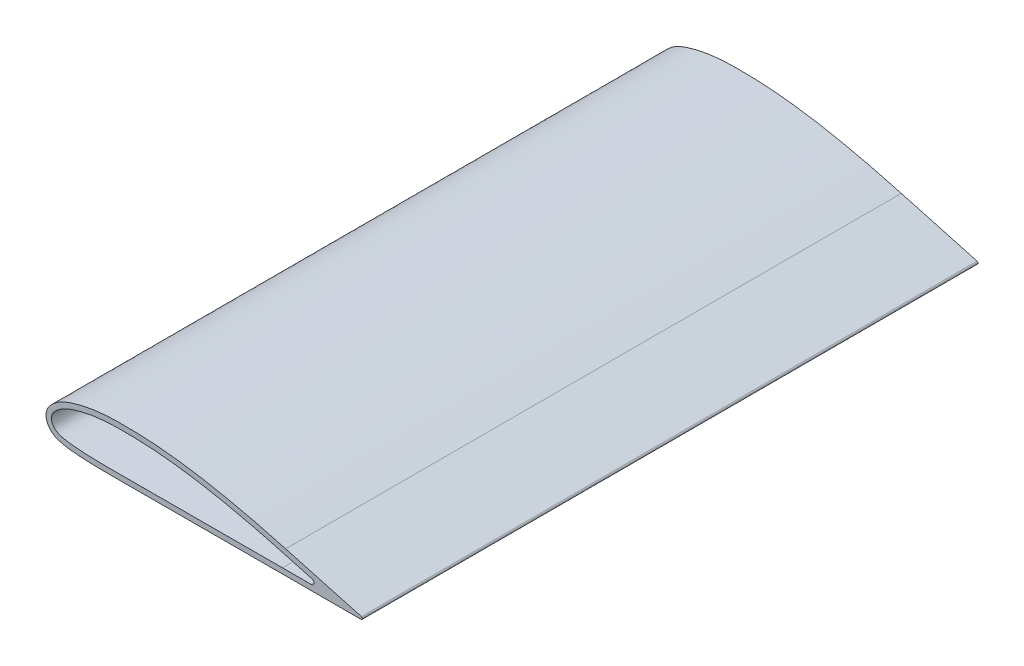
ISO-10303-21;
HEADER;
FILE_DESCRIPTION(('STEP AP214'),'2;1');
FILE_NAME('part.step','',(''),(''),'','','');
FILE_SCHEMA(('AUTOMOTIVE_DESIGN { 1 0 10303 214 1 1 1 1 }'));
ENDSEC;
DATA;
#1=APPLICATION_CONTEXT('core data for automotive mechanical design processes');
#2=APPLICATION_PROTOCOL_DEFINITION('international standard','automotive_design',2000,#1);
#3=PRODUCT_CONTEXT('',#1,'mechanical');
#4=PRODUCT('Part','Part','',(#3));
#5=PRODUCT_RELATED_PRODUCT_CATEGORY('part','',(#4));
#6=PRODUCT_DEFINITION_FORMATION('','',#4);
#7=PRODUCT_DEFINITION_CONTEXT('part definition',#1,'design');
#8=PRODUCT_DEFINITION('design','',#6,#7);
#9=PRODUCT_DEFINITION_SHAPE('','',#8);
#10=(LENGTH_UNIT() NAMED_UNIT(*) SI_UNIT(.MILLI.,.METRE.));
#11=(NAMED_UNIT(*) PLANE_ANGLE_UNIT() SI_UNIT($,.RADIAN.));
#12=(NAMED_UNIT(*) SI_UNIT($,.STERADIAN.) SOLID_ANGLE_UNIT());
#13=UNCERTAINTY_MEASURE_WITH_UNIT(LENGTH_MEASURE(1.E-05),#10,'distance_accuracy_value','');
#14=(GEOMETRIC_REPRESENTATION_CONTEXT(3) GLOBAL_UNCERTAINTY_ASSIGNED_CONTEXT((#13)) GLOBAL_UNIT_ASSIGNED_CONTEXT((#10,
#11,#12)) REPRESENTATION_CONTEXT('',''));
#15=CARTESIAN_POINT('',(0.,0.,0.));
#16=DIRECTION('',(0.,0.,1.));
#17=DIRECTION('',(1.,0.,0.));
#18=AXIS2_PLACEMENT_3D('',#15,#16,#17);
#19=CARTESIAN_POINT('',(442.557049847993,28.8562779930486,1000.));
#20=CARTESIAN_POINT('',(439.072672672651,29.8120661893965,1000.));
#21=CARTESIAN_POINT('',(432.099912620264,31.6715962162049,1000.));
#22=CARTESIAN_POINT('',(421.486806005528,34.1105780280946,1000.));
#23=CARTESIAN_POINT('',(410.779849110611,36.1975398101461,1000.));
#24=CARTESIAN_POINT('',(401.720197274352,37.488657383955,1000.));
#25=CARTESIAN_POINT('',(394.41281853896,38.2045326701608,1000.));
#26=CARTESIAN_POINT('',(388.865337545691,38.5359098487311,1000.));
#27=CARTESIAN_POINT('',(383.377043684156,38.6453962158012,1000.));
#28=CARTESIAN_POINT('',(378.776739099679,38.6310045666827,1000.));
#29=CARTESIAN_POINT('',(374.963490259182,38.4319190984465,1000.));
#30=CARTESIAN_POINT('',(372.066182641251,38.140016341929,1000.));
#31=CARTESIAN_POINT('',(369.210683302152,37.7069672209041,1000.));
#32=CARTESIAN_POINT('',(366.827818433234,37.2314362615503,1000.));
#33=CARTESIAN_POINT('',(364.908429325882,36.7538958923076,1000.));
#34=CARTESIAN_POINT('',(363.479940401,36.3494856552582,1000.));
#35=CARTESIAN_POINT('',(362.056434922454,35.8957673309557,1000.));
#36=CARTESIAN_POINT('',(360.572839348893,35.35285722665,1000.));
#37=CARTESIAN_POINT('',(359.28769826388,34.7841452711708,1000.));
#38=CARTESIAN_POINT('',(358.216447641223,34.2146001399463,1000.));
#39=CARTESIAN_POINT('',(357.389050585476,33.7068980737799,1000.));
#40=CARTESIAN_POINT('',(356.552615658043,33.1030648747338,1000.));
#41=CARTESIAN_POINT('',(355.820762745851,32.4753357525396,1000.));
#42=CARTESIAN_POINT('',(355.354503462645,32.0442095034921,1000.));
#43=CARTESIAN_POINT('',(354.855699670665,31.5528495532229,1000.));
#44=CARTESIAN_POINT('',(354.389957132187,31.0255851572889,1000.));
#45=CARTESIAN_POINT('',(353.964999314076,30.4492034467225,1000.));
#46=CARTESIAN_POINT('',(353.586282932792,29.767186255399,1000.));
#47=CARTESIAN_POINT('',(353.227738954648,28.9329442974887,1000.));
#48=CARTESIAN_POINT('',(352.961298812208,27.6499416267636,1000.));
#49=CARTESIAN_POINT('',(353.111643283169,26.2983268889727,1000.));
#50=CARTESIAN_POINT('',(353.365330175192,25.4506232836227,1000.));
#51=CARTESIAN_POINT('',(353.695602528084,24.7528864611856,1000.));
#52=CARTESIAN_POINT('',(353.998210399166,24.262418144221,1000.));
#53=CARTESIAN_POINT('',(354.347839515911,23.7930228675255,1000.));
#54=CARTESIAN_POINT('',(354.788881725835,23.3017151067969,1000.));
#55=CARTESIAN_POINT('',(355.325142217004,22.8111128434673,1000.));
#56=CARTESIAN_POINT('',(356.055967315444,22.2868342790246,1000.));
#57=CARTESIAN_POINT('',(356.839748985731,21.8718358810368,1000.));
#58=CARTESIAN_POINT('',(357.765467063464,21.5068160558118,1000.));
#59=CARTESIAN_POINT('',(358.640116289018,21.2810109318307,1000.));
#60=CARTESIAN_POINT('',(359.28804598777,21.1302618440849,1000.));
#61=CARTESIAN_POINT('',(360.069783323769,20.9562480213636,1000.));
#62=CARTESIAN_POINT('',(360.904853145306,20.8055776986475,1000.));
#63=CARTESIAN_POINT('',(361.971898145868,20.6520119396105,1000.));
#64=CARTESIAN_POINT('',(363.214024727821,20.526416591067,1000.));
#65=CARTESIAN_POINT('',(364.578709921404,20.4100810965767,1000.));
#66=CARTESIAN_POINT('',(365.978183778209,20.3046202883556,1000.));
#67=CARTESIAN_POINT('',(367.378711377044,20.2199849675604,1000.));
#68=CARTESIAN_POINT('',(369.228950931682,20.131407075753,1000.));
#69=CARTESIAN_POINT('',(371.530679735066,20.0563600982902,1000.));
#70=CARTESIAN_POINT('',(374.271249485054,20.0109189711607,1000.));
#71=CARTESIAN_POINT('',(376.991001378152,19.9944477821466,1000.));
#72=CARTESIAN_POINT('',(379.696108674457,19.9963683471482,1000.));
#73=CARTESIAN_POINT('',(383.274859524469,20.0094440069358,1000.));
#74=CARTESIAN_POINT('',(387.73502139687,20.0176599108285,1000.));
#75=CARTESIAN_POINT('',(393.104461409822,20.0244259580925,1000.));
#76=CARTESIAN_POINT('',(398.470497743268,20.0350356377404,1000.));
#77=CARTESIAN_POINT('',(403.835453793735,20.0447632587505,1000.));
#78=CARTESIAN_POINT('',(410.989397891903,20.0580212802337,1000.));
#79=CARTESIAN_POINT('',(419.93147629828,20.0736388729501,1000.));
#80=CARTESIAN_POINT('',(430.662185951528,20.0932549024161,1000.));
#81=CARTESIAN_POINT('',(437.816630749247,20.1056430744243,1000.));
#82=CARTESIAN_POINT('',(441.393772371793,20.1124523795362,1000.));
#83=B_SPLINE_CURVE_WITH_KNOTS('',3,(#19,#20,#21,#22,#23,#24,#25,#26,#27,#28,#29,#30,#31,#32,#33,
#34,#35,#36,#37,#38,#39,#40,#41,#42,#43,#44,#45,#46,#47,#48,#49,#50,#51,#52,#53,#54,#55,#56,#57,
#58,#59,#60,#61,#62,#63,#64,#65,#66,#67,#68,#69,#70,#71,#72,#73,#74,#75,#76,#77,#78,#79,#80,#81,
#82),.UNSPECIFIED.,.F.,.F.,(4,1,1,1,1,1,1,1,1,1,1,1,1,1,1,1,1,1,1,1,1,1,1,1,1,1,1,1,1,1,1,1,1,1,
1,1,1,1,1,1,1,1,1,1,1,1,1,1,1,1,1,1,1,1,1,1,1,1,1,1,1,4),(0.,0.0624984756248744,
0.124996951249749,0.187495426874623,0.249993902499498,0.281243140311935,0.312492378124372,
0.343741615936809,0.374990853749246,0.390615472655465,0.406240091561684,0.421864710467902,
0.437489329374121,0.44530163882723,0.453113948280339,0.460926257733449,0.468738567186558,
0.476550876639667,0.480457031366222,0.484363186092776,0.488269340819331,0.492175495545886,
0.49608165027244,0.498034727635718,0.499987804998995,0.501940882362272,0.502917421043911,
0.50389395972555,0.505847037088827,0.506823575770466,0.507800114452104,0.508776653133743,
0.509753191815382,0.51072973049702,0.511706269178659,0.513659346541936,0.515612423905214,
0.517565501268491,0.519518578631768,0.523424733358323,0.527330888084878,0.531237042811432,
0.535143197537987,0.539049352264542,0.546861661717651,0.55467397117076,0.562486280623869,
0.570298590076979,0.578110899530088,0.593735518436307,0.609360137342525,0.624984756248744,
0.640609375154962,0.656233994061181,0.687483231873618,0.718732469686055,0.749981707498493,
0.78123094531093,0.812480183123367,0.874978658748241,0.937477134373116,0.99997560999799),.UNSPECIFIED.);
#84=DIRECTION('',(0.,0.,-1.));
#85=VECTOR('',#84,1.);
#86=SURFACE_OF_LINEAR_EXTRUSION('',#83,#85);
#87=DIRECTION('',(0.,0.,-1.));
#88=VECTOR('',#87,1.);
#89=CARTESIAN_POINT('',(441.393772371793,20.1124523795362,1000.));
#90=LINE('',#89,#88);
#91=CARTESIAN_POINT('',(441.393772371793,20.1124523795362,1100.));
#92=VERTEX_POINT('',#91);
#93=CARTESIAN_POINT('',(441.393772371793,20.1124523795362,870.));
#94=VERTEX_POINT('',#93);
#95=EDGE_CURVE('E225',#92,#94,#90,.T.);
#96=ORIENTED_EDGE('',*,*,#95,.F.);
#97=CARTESIAN_POINT('',(442.557049847993,28.8562779930486,1100.));
#98=CARTESIAN_POINT('',(439.072672672651,29.8120661893965,1100.));
#99=CARTESIAN_POINT('',(432.099912620264,31.6715962162049,1100.));
#100=CARTESIAN_POINT('',(421.486806005528,34.1105780280946,1100.));
#101=CARTESIAN_POINT('',(410.779849110611,36.1975398101461,1100.));
#102=CARTESIAN_POINT('',(401.720197274352,37.488657383955,1100.));
#103=CARTESIAN_POINT('',(394.41281853896,38.2045326701608,1100.));
#104=CARTESIAN_POINT('',(388.865337545691,38.5359098487311,1100.));
#105=CARTESIAN_POINT('',(383.377043684156,38.6453962158012,1100.));
#106=CARTESIAN_POINT('',(378.776739099679,38.6310045666827,1100.));
#107=CARTESIAN_POINT('',(374.963490259182,38.4319190984465,1100.));
#108=CARTESIAN_POINT('',(372.066182641251,38.140016341929,1100.));
#109=CARTESIAN_POINT('',(369.210683302152,37.7069672209041,1100.));
#110=CARTESIAN_POINT('',(366.827818433234,37.2314362615503,1100.));
#111=CARTESIAN_POINT('',(364.908429325882,36.7538958923076,1100.));
#112=CARTESIAN_POINT('',(363.479940401,36.3494856552582,1100.));
#113=CARTESIAN_POINT('',(362.056434922454,35.8957673309557,1100.));
#114=CARTESIAN_POINT('',(360.572839348893,35.35285722665,1100.));
#115=CARTESIAN_POINT('',(359.28769826388,34.7841452711708,1100.));
#116=CARTESIAN_POINT('',(358.216447641223,34.2146001399463,1100.));
#117=CARTESIAN_POINT('',(357.389050585476,33.7068980737799,1100.));
#118=CARTESIAN_POINT('',(356.552615658043,33.1030648747338,1100.));
#119=CARTESIAN_POINT('',(355.820762745851,32.4753357525396,1100.));
#120=CARTESIAN_POINT('',(355.354503462645,32.0442095034921,1100.));
#121=CARTESIAN_POINT('',(354.855699670665,31.5528495532229,1100.));
#122=CARTESIAN_POINT('',(354.389957132187,31.0255851572889,1100.));
#123=CARTESIAN_POINT('',(353.964999314076,30.4492034467225,1100.));
#124=CARTESIAN_POINT('',(353.586282932792,29.767186255399,1100.));
#125=CARTESIAN_POINT('',(353.227738954648,28.9329442974887,1100.));
#126=CARTESIAN_POINT('',(352.961298812208,27.6499416267636,1100.));
#127=CARTESIAN_POINT('',(353.111643283169,26.2983268889727,1100.));
#128=CARTESIAN_POINT('',(353.365330175192,25.4506232836227,1100.));
#129=CARTESIAN_POINT('',(353.695602528084,24.7528864611856,1100.));
#130=CARTESIAN_POINT('',(353.998210399166,24.262418144221,1100.));
#131=CARTESIAN_POINT('',(354.347839515911,23.7930228675255,1100.));
#132=CARTESIAN_POINT('',(354.788881725835,23.3017151067969,1100.));
#133=CARTESIAN_POINT('',(355.325142217004,22.8111128434673,1100.));
#134=CARTESIAN_POINT('',(356.055967315444,22.2868342790246,1100.));
#135=CARTESIAN_POINT('',(356.839748985731,21.8718358810368,1100.));
#136=CARTESIAN_POINT('',(357.765467063464,21.5068160558118,1100.));
#137=CARTESIAN_POINT('',(358.640116289018,21.2810109318307,1100.));
#138=CARTESIAN_POINT('',(359.28804598777,21.1302618440849,1100.));
#139=CARTESIAN_POINT('',(360.069783323769,20.9562480213636,1100.));
#140=CARTESIAN_POINT('',(360.904853145306,20.8055776986475,1100.));
#141=CARTESIAN_POINT('',(361.971898145868,20.6520119396105,1100.));
#142=CARTESIAN_POINT('',(363.214024727821,20.526416591067,1100.));
#143=CARTESIAN_POINT('',(364.578709921404,20.4100810965767,1100.));
#144=CARTESIAN_POINT('',(365.978183778209,20.3046202883556,1100.));
#145=CARTESIAN_POINT('',(367.378711377044,20.2199849675604,1100.));
#146=CARTESIAN_POINT('',(369.228950931682,20.131407075753,1100.));
#147=CARTESIAN_POINT('',(371.530679735066,20.0563600982902,1100.));
#148=CARTESIAN_POINT('',(374.271249485054,20.0109189711607,1100.));
#149=CARTESIAN_POINT('',(376.991001378152,19.9944477821466,1100.));
#150=CARTESIAN_POINT('',(379.696108674457,19.9963683471482,1100.));
#151=CARTESIAN_POINT('',(383.274859524469,20.0094440069358,1100.));
#152=CARTESIAN_POINT('',(387.73502139687,20.0176599108285,1100.));
#153=CARTESIAN_POINT('',(393.104461409822,20.0244259580925,1100.));
#154=CARTESIAN_POINT('',(398.470497743268,20.0350356377404,1100.));
#155=CARTESIAN_POINT('',(403.835453793735,20.0447632587505,1100.));
#156=CARTESIAN_POINT('',(410.989397891903,20.0580212802337,1100.));
#157=CARTESIAN_POINT('',(419.93147629828,20.0736388729501,1100.));
#158=CARTESIAN_POINT('',(430.662185951528,20.0932549024161,1100.));
#159=CARTESIAN_POINT('',(437.816630749247,20.1056430744243,1100.));
#160=CARTESIAN_POINT('',(441.393772371793,20.1124523795362,1100.));
#161=B_SPLINE_CURVE_WITH_KNOTS('',3,(#97,#98,#99,#100,#101,#102,#103,#104,#105,#106,#107,#108,
#109,#110,#111,#112,#113,#114,#115,#116,#117,#118,#119,#120,#121,#122,#123,#124,#125,#126,#127,
#128,#129,#130,#131,#132,#133,#134,#135,#136,#137,#138,#139,#140,#141,#142,#143,#144,#145,#146,
#147,#148,#149,#150,#151,#152,#153,#154,#155,#156,#157,#158,#159,#160),.UNSPECIFIED.,.F.,.F.,(4,
1,1,1,1,1,1,1,1,1,1,1,1,1,1,1,1,1,1,1,1,1,1,1,1,1,1,1,1,1,1,1,1,1,1,1,1,1,1,1,1,1,1,1,1,1,1,1,1,
1,1,1,1,1,1,1,1,1,1,1,1,4),(0.,0.0624984756248744,0.124996951249749,0.187495426874623,
0.249993902499498,0.281243140311935,0.312492378124372,0.343741615936809,0.374990853749246,
0.390615472655465,0.406240091561684,0.421864710467902,0.437489329374121,0.44530163882723,
0.453113948280339,0.460926257733449,0.468738567186558,0.476550876639667,0.480457031366222,
0.484363186092776,0.488269340819331,0.492175495545886,0.49608165027244,0.498034727635718,
0.499987804998995,0.501940882362272,0.502917421043911,0.50389395972555,0.505847037088827,
0.506823575770466,0.507800114452104,0.508776653133743,0.509753191815382,0.51072973049702,
0.511706269178659,0.513659346541936,0.515612423905214,0.517565501268491,0.519518578631768,
0.523424733358323,0.527330888084878,0.531237042811432,0.535143197537987,0.539049352264542,
0.546861661717651,0.55467397117076,0.562486280623869,0.570298590076979,0.578110899530088,
0.593735518436307,0.609360137342525,0.624984756248744,0.640609375154962,0.656233994061181,
0.687483231873618,0.718732469686055,0.749981707498493,0.78123094531093,0.812480183123367,
0.874978658748241,0.937477134373116,0.99997560999799),.UNSPECIFIED.);
#162=CARTESIAN_POINT('',(442.557049847993,28.8562779930486,1100.));
#163=VERTEX_POINT('',#162);
#164=EDGE_CURVE('E153',#163,#92,#161,.T.);
#165=ORIENTED_EDGE('',*,*,#164,.F.);
#166=DIRECTION('',(0.,0.,-1.));
#167=VECTOR('',#166,1.);
#168=CARTESIAN_POINT('',(442.557049847993,28.8562779930486,1000.));
#169=LINE('',#168,#167);
#170=CARTESIAN_POINT('',(442.557049847993,28.8562779930486,870.));
#171=VERTEX_POINT('',#170);
#172=EDGE_CURVE('E231',#163,#171,#169,.T.);
#173=ORIENTED_EDGE('',*,*,#172,.T.);
#174=CARTESIAN_POINT('',(442.557049847993,28.8562779930486,870.));
#175=CARTESIAN_POINT('',(439.072672672651,29.8120661893965,870.));
#176=CARTESIAN_POINT('',(432.099912620264,31.6715962162049,870.));
#177=CARTESIAN_POINT('',(421.486806005528,34.1105780280946,870.));
#178=CARTESIAN_POINT('',(410.779849110611,36.1975398101461,870.));
#179=CARTESIAN_POINT('',(401.720197274352,37.488657383955,870.));
#180=CARTESIAN_POINT('',(394.41281853896,38.2045326701608,870.));
#181=CARTESIAN_POINT('',(388.865337545691,38.5359098487311,870.));
#182=CARTESIAN_POINT('',(383.377043684156,38.6453962158012,870.));
#183=CARTESIAN_POINT('',(378.776739099679,38.6310045666827,870.));
#184=CARTESIAN_POINT('',(374.963490259182,38.4319190984465,870.));
#185=CARTESIAN_POINT('',(372.066182641251,38.140016341929,870.));
#186=CARTESIAN_POINT('',(369.210683302152,37.7069672209041,870.));
#187=CARTESIAN_POINT('',(366.827818433234,37.2314362615503,870.));
#188=CARTESIAN_POINT('',(364.908429325882,36.7538958923076,870.));
#189=CARTESIAN_POINT('',(363.479940401,36.3494856552582,870.));
#190=CARTESIAN_POINT('',(362.056434922454,35.8957673309557,870.));
#191=CARTESIAN_POINT('',(360.572839348893,35.35285722665,870.));
#192=CARTESIAN_POINT('',(359.28769826388,34.7841452711708,870.));
#193=CARTESIAN_POINT('',(358.216447641223,34.2146001399463,870.));
#194=CARTESIAN_POINT('',(357.389050585476,33.7068980737799,870.));
#195=CARTESIAN_POINT('',(356.552615658043,33.1030648747338,870.));
#196=CARTESIAN_POINT('',(355.820762745851,32.4753357525396,870.));
#197=CARTESIAN_POINT('',(355.354503462645,32.0442095034921,870.));
#198=CARTESIAN_POINT('',(354.855699670665,31.5528495532229,870.));
#199=CARTESIAN_POINT('',(354.389957132187,31.0255851572889,870.));
#200=CARTESIAN_POINT('',(353.964999314076,30.4492034467225,870.));
#201=CARTESIAN_POINT('',(353.586282932792,29.767186255399,870.));
#202=CARTESIAN_POINT('',(353.227738954648,28.9329442974887,870.));
#203=CARTESIAN_POINT('',(352.961298812208,27.6499416267636,870.));
#204=CARTESIAN_POINT('',(353.111643283169,26.2983268889727,870.));
#205=CARTESIAN_POINT('',(353.365330175192,25.4506232836227,870.));
#206=CARTESIAN_POINT('',(353.695602528084,24.7528864611856,870.));
#207=CARTESIAN_POINT('',(353.998210399166,24.262418144221,870.));
#208=CARTESIAN_POINT('',(354.347839515911,23.7930228675255,870.));
#209=CARTESIAN_POINT('',(354.788881725835,23.3017151067969,870.));
#210=CARTESIAN_POINT('',(355.325142217004,22.8111128434673,870.));
#211=CARTESIAN_POINT('',(356.055967315444,22.2868342790246,870.));
#212=CARTESIAN_POINT('',(356.839748985731,21.8718358810368,870.));
#213=CARTESIAN_POINT('',(357.765467063464,21.5068160558118,870.));
#214=CARTESIAN_POINT('',(358.640116289018,21.2810109318307,870.));
#215=CARTESIAN_POINT('',(359.28804598777,21.1302618440849,870.));
#216=CARTESIAN_POINT('',(360.069783323769,20.9562480213636,870.));
#217=CARTESIAN_POINT('',(360.904853145306,20.8055776986475,870.));
#218=CARTESIAN_POINT('',(361.971898145868,20.6520119396105,870.));
#219=CARTESIAN_POINT('',(363.214024727821,20.526416591067,870.));
#220=CARTESIAN_POINT('',(364.578709921404,20.4100810965767,870.));
#221=CARTESIAN_POINT('',(365.978183778209,20.3046202883556,870.));
#222=CARTESIAN_POINT('',(367.378711377044,20.2199849675604,870.));
#223=CARTESIAN_POINT('',(369.228950931682,20.131407075753,870.));
#224=CARTESIAN_POINT('',(371.530679735066,20.0563600982902,870.));
#225=CARTESIAN_POINT('',(374.271249485054,20.0109189711607,870.));
#226=CARTESIAN_POINT('',(376.991001378152,19.9944477821466,870.));
#227=CARTESIAN_POINT('',(379.696108674457,19.9963683471482,870.));
#228=CARTESIAN_POINT('',(383.274859524469,20.0094440069358,870.));
#229=CARTESIAN_POINT('',(387.73502139687,20.0176599108285,870.));
#230=CARTESIAN_POINT('',(393.104461409822,20.0244259580925,870.));
#231=CARTESIAN_POINT('',(398.470497743268,20.0350356377404,870.));
#232=CARTESIAN_POINT('',(403.835453793735,20.0447632587505,870.));
#233=CARTESIAN_POINT('',(410.989397891903,20.0580212802337,870.));
#234=CARTESIAN_POINT('',(419.93147629828,20.0736388729501,870.));
#235=CARTESIAN_POINT('',(430.662185951528,20.0932549024161,870.));
#236=CARTESIAN_POINT('',(437.816630749247,20.1056430744243,870.));
#237=CARTESIAN_POINT('',(441.393772371793,20.1124523795362,870.));
#238=B_SPLINE_CURVE_WITH_KNOTS('',3,(#174,#175,#176,#177,#178,#179,#180,#181,#182,#183,#184,
#185,#186,#187,#188,#189,#190,#191,#192,#193,#194,#195,#196,#197,#198,#199,#200,#201,#202,#203,
#204,#205,#206,#207,#208,#209,#210,#211,#212,#213,#214,#215,#216,#217,#218,#219,#220,#221,#222,
#223,#224,#225,#226,#227,#228,#229,#230,#231,#232,#233,#234,#235,#236,#237),.UNSPECIFIED.,.F.,
.F.,(4,1,1,1,1,1,1,1,1,1,1,1,1,1,1,1,1,1,1,1,1,1,1,1,1,1,1,1,1,1,1,1,1,1,1,1,1,1,1,1,1,1,1,1,1,
1,1,1,1,1,1,1,1,1,1,1,1,1,1,1,1,4),(0.,0.0624984756248744,0.124996951249749,0.187495426874623,
0.249993902499498,0.281243140311935,0.312492378124372,0.343741615936809,0.374990853749246,
0.390615472655465,0.406240091561684,0.421864710467902,0.437489329374121,0.44530163882723,
0.453113948280339,0.460926257733449,0.468738567186558,0.476550876639667,0.480457031366222,
0.484363186092776,0.488269340819331,0.492175495545886,0.49608165027244,0.498034727635718,
0.499987804998995,0.501940882362272,0.502917421043911,0.50389395972555,0.505847037088827,
0.506823575770466,0.507800114452104,0.508776653133743,0.509753191815382,0.51072973049702,
0.511706269178659,0.513659346541936,0.515612423905214,0.517565501268491,0.519518578631768,
0.523424733358323,0.527330888084878,0.531237042811432,0.535143197537987,0.539049352264542,
0.546861661717651,0.55467397117076,0.562486280623869,0.570298590076979,0.578110899530088,
0.593735518436307,0.609360137342525,0.624984756248744,0.640609375154962,0.656233994061181,
0.687483231873618,0.718732469686055,0.749981707498493,0.78123094531093,0.812480183123367,
0.874978658748241,0.937477134373116,0.99997560999799),.UNSPECIFIED.);
#239=EDGE_CURVE('E230',#94,#171,#238,.F.);
#240=ORIENTED_EDGE('',*,*,#239,.F.);
#241=EDGE_LOOP('',(#96,#165,#173,#240));
#242=FACE_BOUND('',#241,.T.);
#243=ADVANCED_FACE('F53',(#242),#86,.F.);
#244=CARTESIAN_POINT('',(441.391868782605,22.1124523795362,1105.57598100583));
#245=CARTESIAN_POINT('',(426.43104676942,22.08397263802,1105.57598100583));
#246=CARTESIAN_POINT('',(411.470231516334,22.0595279111327,1105.57598100583));
#247=CARTESIAN_POINT('',(392.769204224448,22.0240622921064,1105.57598100583));
#248=CARTESIAN_POINT('',(389.029004476036,22.0203773720933,1105.57598100583));
#249=CARTESIAN_POINT('',(383.418695240026,22.0091118836683,1105.57598100583));
#250=CARTESIAN_POINT('',(381.548586047893,22.0017076743509,1105.57598100583));
#251=CARTESIAN_POINT('',(377.808378899596,21.9936058590423,1105.57598100583));
#252=CARTESIAN_POINT('',(375.938285089183,21.9953827981766,1105.57598100583));
#253=CARTESIAN_POINT('',(372.198168088009,22.041088629379,1105.57598100583));
#254=CARTESIAN_POINT('',(370.328146212908,22.0858028209379,1105.57598100583));
#255=CARTESIAN_POINT('',(367.523216420346,22.2143654605857,1105.57598100583));
#256=CARTESIAN_POINT('',(366.587868468745,22.2680440022288,1105.57598100583));
#257=CARTESIAN_POINT('',(365.188580513136,22.3695894205047,1105.57598100583));
#258=CARTESIAN_POINT('',(364.722570197919,22.4063147068405,1105.57598100583));
#259=CARTESIAN_POINT('',(363.791288859399,22.4848411462601,1105.57598100583));
#260=CARTESIAN_POINT('',(363.325978450835,22.526371886082,1105.57598100583));
#261=CARTESIAN_POINT('',(362.39711565905,22.6215037025125,1105.57598100583));
#262=CARTESIAN_POINT('',(361.933783404499,22.676616149356,1105.57598100583));
#263=CARTESIAN_POINT('',(361.01130099976,22.815554740675,1105.57598100583));
#264=CARTESIAN_POINT('',(360.552321230968,22.900550698101,1105.57598100583));
#265=CARTESIAN_POINT('',(359.867077442885,23.0501929373881,1105.57598100583));
#266=CARTESIAN_POINT('',(359.63893990269,23.1019759073727,1105.57598100583));
#267=CARTESIAN_POINT('',(359.183231587739,23.2094331733248,1105.57598100583));
#268=CARTESIAN_POINT('',(358.955606147243,23.2647321425803,1105.57598100583));
#269=CARTESIAN_POINT('',(358.502499327183,23.3900508799862,1105.57598100583));
#270=CARTESIAN_POINT('',(358.277185970096,23.4612242651199,1105.57598100583));
#271=CARTESIAN_POINT('',(357.830586010665,23.6312181259494,1105.57598100583));
#272=CARTESIAN_POINT('',(357.612320002094,23.7295014497609,1105.57598100583));
#273=CARTESIAN_POINT('',(357.194331971757,23.9525737916366,1105.57598100583));
#274=CARTESIAN_POINT('',(356.993859392065,24.0783060106738,1105.57598100583));
#275=CARTESIAN_POINT('',(356.610612495537,24.3592543768349,1105.57598100583));
#276=CARTESIAN_POINT('',(356.425872136541,24.5147620890911,1105.57598100583));
#277=CARTESIAN_POINT('',(355.915475357426,25.012444027194,1105.57598100583));
#278=CARTESIAN_POINT('',(355.628575393027,25.3867777514168,1105.57598100583));
#279=CARTESIAN_POINT('',(355.300686436792,26.0299670404256,1105.57598100583));
#280=CARTESIAN_POINT('',(355.215790774723,26.2526956612466,1105.57598100583));
#281=CARTESIAN_POINT('',(355.089582364246,26.7111489142224,1105.57598100583));
#282=CARTESIAN_POINT('',(355.049447074767,26.9506433955404,1105.57598100583));
#283=CARTESIAN_POINT('',(355.025587898021,27.4265590758584,1105.57598100583));
#284=CARTESIAN_POINT('',(355.038677269927,27.6635845902844,1105.57598100583));
#285=CARTESIAN_POINT('',(355.114974434629,28.1357679678449,1105.57598100583));
#286=CARTESIAN_POINT('',(355.180681315088,28.368189321066,1105.57598100583));
#287=CARTESIAN_POINT('',(355.350772609719,28.812821010228,1105.57598100583));
#288=CARTESIAN_POINT('',(355.458679319452,29.0283686254038,1105.57598100583));
#289=CARTESIAN_POINT('',(355.707313102453,29.4371660358359,1105.57598100583));
#290=CARTESIAN_POINT('',(355.846392643853,29.6296599992838,1105.57598100583));
#291=CARTESIAN_POINT('',(356.146266547118,29.9971368877181,1105.57598100583));
#292=CARTESIAN_POINT('',(356.307530089416,30.1717414611261,1105.57598100583));
#293=CARTESIAN_POINT('',(356.644989905089,30.5089087110874,1105.57598100583));
#294=CARTESIAN_POINT('',(356.818712573873,30.6733507540614,1105.57598100583));
#295=CARTESIAN_POINT('',(357.346253611538,31.1544988388364,1105.57598100583));
#296=CARTESIAN_POINT('',(357.707560808053,31.4617913499941,1105.57598100583));
#297=CARTESIAN_POINT('',(358.469875283054,32.0207366290852,1105.57598100583));
#298=CARTESIAN_POINT('',(358.868826818016,32.2752705256257,1105.57598100583));
#299=CARTESIAN_POINT('',(359.696379635188,32.7427841394314,1105.57598100583));
#300=CARTESIAN_POINT('',(360.12646353816,32.9567789635096,1105.57598100583));
#301=CARTESIAN_POINT('',(360.992904724393,33.3491468202565,1105.57598100583));
#302=CARTESIAN_POINT('',(361.431085623421,33.5278322946359,1105.57598100583));
#303=CARTESIAN_POINT('',(362.75620427926,34.0265799446804,1105.57598100583));
#304=CARTESIAN_POINT('',(363.652700048945,34.3129243514126,1105.57598100583));
#305=CARTESIAN_POINT('',(365.460493513268,34.8333964654542,1105.57598100583));
#306=CARTESIAN_POINT('',(366.372693367087,35.0643416289415,1105.57598100583));
#307=CARTESIAN_POINT('',(368.212768256617,35.4709346710192,1105.57598100583));
#308=CARTESIAN_POINT('',(369.140429763328,35.6473358151184,1105.57598100583));
#309=CARTESIAN_POINT('',(371.007615496971,35.9582900262553,1105.57598100583));
#310=CARTESIAN_POINT('',(371.945160192088,36.0911584899177,1105.57598100583));
#311=CARTESIAN_POINT('',(373.815233302003,36.3080185100211,1105.57598100583));
#312=CARTESIAN_POINT('',(374.749657227099,36.3925812997912,1105.57598100583));
#313=CARTESIAN_POINT('',(377.551234730572,36.5802631598305,1105.57598100583));
#314=CARTESIAN_POINT('',(379.416847386203,36.6233499905356,1105.57598100583));
#315=CARTESIAN_POINT('',(382.213871456839,36.6336363441232,1105.57598100583));
#316=CARTESIAN_POINT('',(383.145978939488,36.6279537089926,1105.57598100583));
#317=CARTESIAN_POINT('',(385.009931909083,36.6063814450585,1105.57598100583));
#318=CARTESIAN_POINT('',(385.94175095081,36.5894615467006,1105.57598100583));
#319=CARTESIAN_POINT('',(388.736581531536,36.5142925378554,1105.57598100583));
#320=CARTESIAN_POINT('',(390.598900480799,36.4290610798787,1105.57598100583));
#321=CARTESIAN_POINT('',(394.321587368365,36.1825894492724,1105.57598100583));
#322=CARTESIAN_POINT('',(396.181961675232,36.0215973871779,1105.57598100583));
#323=CARTESIAN_POINT('',(399.901101704068,35.6369449986352,1105.57598100583));
#324=CARTESIAN_POINT('',(401.759906344725,35.4148008909695,1105.57598100583));
#325=CARTESIAN_POINT('',(405.47614182307,34.916991193652,1105.57598100583));
#326=CARTESIAN_POINT('',(407.331890272434,34.6411031098613,1105.57598100583));
#327=CARTESIAN_POINT('',(412.87894287126,33.7401856003294,1105.57598100583));
#328=CARTESIAN_POINT('',(416.55525172399,33.0393514533272,1105.57598100583));
#329=CARTESIAN_POINT('',(423.87918071652,31.5053428492665,1105.57598100583));
#330=CARTESIAN_POINT('',(427.52739746812,30.6749205474115,1105.57598100583));
#331=CARTESIAN_POINT('',(434.795324571933,28.8825766414292,1105.57598100583));
#332=CARTESIAN_POINT('',(438.414610553982,27.9186974284238,1105.57598100583));
#333=CARTESIAN_POINT('',(442.027980081259,26.9275257585905,1105.57598100583));
#334=B_SPLINE_CURVE_WITH_KNOTS('',3,(#244,#245,#246,#247,#248,#249,#250,#251,#252,#253,#254,
#255,#256,#257,#258,#259,#260,#261,#262,#263,#264,#265,#266,#267,#268,#269,#270,#271,#272,#273,
#274,#275,#276,#277,#278,#279,#280,#281,#282,#283,#284,#285,#286,#287,#288,#289,#290,#291,#292,
#293,#294,#295,#296,#297,#298,#299,#300,#301,#302,#303,#304,#305,#306,#307,#308,#309,#310,#311,
#312,#313,#314,#315,#316,#317,#318,#319,#320,#321,#322,#323,#324,#325,#326,#327,#328,#329,#330,
#331,#332,#333),.UNSPECIFIED.,.F.,.F.,(4,2,2,2,2,2,2,2,2,2,2,2,2,2,2,2,2,2,2,2,2,2,2,2,2,2,2,2,
2,2,2,2,2,2,2,2,2,2,2,2,2,2,2,2,4),(0.,0.249999999999962,0.312499999999953,0.343749999999948,
0.374999999999943,0.406249999999939,0.421874999999937,0.429687499999936,0.437499999999935,
0.445312499999934,0.453124999999933,0.457031249999933,0.460937499999933,0.464843749999933,
0.468749999999933,0.472656249999933,0.476562499999933,0.484374999999933,0.488281249999933,
0.492187499999934,0.496093749999934,0.499999999999934,0.503906249999935,0.507812499999935,
0.511718749999935,0.515624999999935,0.523437499999937,0.531249999999938,0.539062499999939,
0.54687499999994,0.562499999999943,0.578124999999945,0.593749999999948,0.60937499999995,
0.624999999999953,0.656249999999956,0.671874999999958,0.68749999999996,0.718749999999964,
0.749999999999968,0.781249999999972,0.812499999999976,0.874999999999984,0.937499999999992,1.),.UNSPECIFIED.);
#335=DIRECTION('',(0.,0.,-1.));
#336=VECTOR('',#335,1.);
#337=SURFACE_OF_LINEAR_EXTRUSION('',#334,#336);
#338=DIRECTION('',(0.,0.,-1.));
#339=VECTOR('',#338,1.);
#340=CARTESIAN_POINT('',(442.027980081259,26.9275257585905,1105.57598100583));
#341=LINE('',#340,#339);
#342=CARTESIAN_POINT('',(442.027980081259,26.9275257585905,1100.));
#343=VERTEX_POINT('',#342);
#344=CARTESIAN_POINT('',(442.027980081259,26.9275257585905,870.));
#345=VERTEX_POINT('',#344);
#346=EDGE_CURVE('E117',#343,#345,#341,.T.);
#347=ORIENTED_EDGE('',*,*,#346,.F.);
#348=CARTESIAN_POINT('',(441.391868782605,22.1124523795362,1100.));
#349=CARTESIAN_POINT('',(426.43104676942,22.08397263802,1100.));
#350=CARTESIAN_POINT('',(411.470231516334,22.0595279111327,1100.));
#351=CARTESIAN_POINT('',(392.769204224448,22.0240622921064,1100.));
#352=CARTESIAN_POINT('',(389.029004476036,22.0203773720934,1100.));
#353=CARTESIAN_POINT('',(383.418695240026,22.0091118836683,1100.));
#354=CARTESIAN_POINT('',(381.548586047893,22.0017076743509,1100.));
#355=CARTESIAN_POINT('',(377.808378899596,21.9936058590423,1100.));
#356=CARTESIAN_POINT('',(375.938285089183,21.9953827981766,1100.));
#357=CARTESIAN_POINT('',(372.198168088009,22.041088629379,1100.));
#358=CARTESIAN_POINT('',(370.328146212908,22.0858028209379,1100.));
#359=CARTESIAN_POINT('',(367.523216420346,22.2143654605857,1100.));
#360=CARTESIAN_POINT('',(366.587868468745,22.2680440022288,1100.));
#361=CARTESIAN_POINT('',(365.188580513136,22.3695894205047,1100.));
#362=CARTESIAN_POINT('',(364.722570197919,22.4063147068405,1100.));
#363=CARTESIAN_POINT('',(363.791288859399,22.4848411462601,1100.));
#364=CARTESIAN_POINT('',(363.325978450835,22.526371886082,1100.));
#365=CARTESIAN_POINT('',(362.39711565905,22.6215037025125,1100.));
#366=CARTESIAN_POINT('',(361.933783404499,22.676616149356,1100.));
#367=CARTESIAN_POINT('',(361.01130099976,22.815554740675,1100.));
#368=CARTESIAN_POINT('',(360.552321230968,22.900550698101,1100.));
#369=CARTESIAN_POINT('',(359.867077442885,23.0501929373881,1100.));
#370=CARTESIAN_POINT('',(359.63893990269,23.1019759073727,1100.));
#371=CARTESIAN_POINT('',(359.183231587739,23.2094331733248,1100.));
#372=CARTESIAN_POINT('',(358.955606147243,23.2647321425803,1100.));
#373=CARTESIAN_POINT('',(358.502499327183,23.3900508799862,1100.));
#374=CARTESIAN_POINT('',(358.277185970096,23.4612242651199,1100.));
#375=CARTESIAN_POINT('',(357.830586010665,23.6312181259494,1100.));
#376=CARTESIAN_POINT('',(357.612320002094,23.7295014497609,1100.));
#377=CARTESIAN_POINT('',(357.194331971757,23.9525737916366,1100.));
#378=CARTESIAN_POINT('',(356.993859392065,24.0783060106738,1100.));
#379=CARTESIAN_POINT('',(356.610612495537,24.3592543768349,1100.));
#380=CARTESIAN_POINT('',(356.425872136541,24.5147620890911,1100.));
#381=CARTESIAN_POINT('',(355.915475357426,25.012444027194,1100.));
#382=CARTESIAN_POINT('',(355.628575393027,25.3867777514168,1100.));
#383=CARTESIAN_POINT('',(355.300686436792,26.0299670404256,1100.));
#384=CARTESIAN_POINT('',(355.215790774723,26.2526956612466,1100.));
#385=CARTESIAN_POINT('',(355.089582364246,26.7111489142224,1100.));
#386=CARTESIAN_POINT('',(355.049447074767,26.9506433955404,1100.));
#387=CARTESIAN_POINT('',(355.025587898021,27.4265590758584,1100.));
#388=CARTESIAN_POINT('',(355.038677269927,27.6635845902844,1100.));
#389=CARTESIAN_POINT('',(355.114974434629,28.135767967845,1100.));
#390=CARTESIAN_POINT('',(355.180681315088,28.3681893210661,1100.));
#391=CARTESIAN_POINT('',(355.350772609719,28.812821010228,1100.));
#392=CARTESIAN_POINT('',(355.458679319452,29.0283686254038,1100.));
#393=CARTESIAN_POINT('',(355.707313102453,29.4371660358359,1100.));
#394=CARTESIAN_POINT('',(355.846392643853,29.6296599992839,1100.));
#395=CARTESIAN_POINT('',(356.146266547118,29.9971368877181,1100.));
#396=CARTESIAN_POINT('',(356.307530089416,30.1717414611261,1100.));
#397=CARTESIAN_POINT('',(356.644989905089,30.5089087110875,1100.));
#398=CARTESIAN_POINT('',(356.818712573873,30.6733507540614,1100.));
#399=CARTESIAN_POINT('',(357.346253611538,31.1544988388364,1100.));
#400=CARTESIAN_POINT('',(357.707560808053,31.4617913499941,1100.));
#401=CARTESIAN_POINT('',(358.469875283054,32.0207366290852,1100.));
#402=CARTESIAN_POINT('',(358.868826818016,32.2752705256257,1100.));
#403=CARTESIAN_POINT('',(359.696379635188,32.7427841394314,1100.));
#404=CARTESIAN_POINT('',(360.12646353816,32.9567789635096,1100.));
#405=CARTESIAN_POINT('',(360.992904724393,33.3491468202565,1100.));
#406=CARTESIAN_POINT('',(361.431085623421,33.527832294636,1100.));
#407=CARTESIAN_POINT('',(362.75620427926,34.0265799446804,1100.));
#408=CARTESIAN_POINT('',(363.652700048945,34.3129243514126,1100.));
#409=CARTESIAN_POINT('',(365.460493513268,34.8333964654542,1100.));
#410=CARTESIAN_POINT('',(366.372693367087,35.0643416289415,1100.));
#411=CARTESIAN_POINT('',(368.212768256617,35.4709346710192,1100.));
#412=CARTESIAN_POINT('',(369.140429763328,35.6473358151184,1100.));
#413=CARTESIAN_POINT('',(371.007615496971,35.9582900262553,1100.));
#414=CARTESIAN_POINT('',(371.945160192088,36.0911584899177,1100.));
#415=CARTESIAN_POINT('',(373.815233302003,36.3080185100211,1100.));
#416=CARTESIAN_POINT('',(374.749657227099,36.3925812997912,1100.));
#417=CARTESIAN_POINT('',(377.551234730572,36.5802631598305,1100.));
#418=CARTESIAN_POINT('',(379.416847386203,36.6233499905356,1100.));
#419=CARTESIAN_POINT('',(382.213871456839,36.6336363441232,1100.));
#420=CARTESIAN_POINT('',(383.145978939488,36.6279537089926,1100.));
#421=CARTESIAN_POINT('',(385.009931909083,36.6063814450585,1100.));
#422=CARTESIAN_POINT('',(385.94175095081,36.5894615467006,1100.));
#423=CARTESIAN_POINT('',(388.736581531536,36.5142925378554,1100.));
#424=CARTESIAN_POINT('',(390.598900480799,36.4290610798787,1100.));
#425=CARTESIAN_POINT('',(394.321587368365,36.1825894492724,1100.));
#426=CARTESIAN_POINT('',(396.181961675232,36.0215973871779,1100.));
#427=CARTESIAN_POINT('',(399.901101704068,35.6369449986352,1100.));
#428=CARTESIAN_POINT('',(401.759906344725,35.4148008909695,1100.));
#429=CARTESIAN_POINT('',(405.47614182307,34.916991193652,1100.));
#430=CARTESIAN_POINT('',(407.331890272434,34.6411031098613,1100.));
#431=CARTESIAN_POINT('',(412.87894287126,33.7401856003294,1100.));
#432=CARTESIAN_POINT('',(416.55525172399,33.0393514533272,1100.));
#433=CARTESIAN_POINT('',(423.87918071652,31.5053428492665,1100.));
#434=CARTESIAN_POINT('',(427.52739746812,30.6749205474115,1100.));
#435=CARTESIAN_POINT('',(434.795324571933,28.8825766414292,1100.));
#436=CARTESIAN_POINT('',(438.414610553982,27.9186974284238,1100.));
#437=CARTESIAN_POINT('',(442.027980081259,26.9275257585905,1100.));
#438=B_SPLINE_CURVE_WITH_KNOTS('',3,(#348,#349,#350,#351,#352,#353,#354,#355,#356,#357,#358,
#359,#360,#361,#362,#363,#364,#365,#366,#367,#368,#369,#370,#371,#372,#373,#374,#375,#376,#377,
#378,#379,#380,#381,#382,#383,#384,#385,#386,#387,#388,#389,#390,#391,#392,#393,#394,#395,#396,
#397,#398,#399,#400,#401,#402,#403,#404,#405,#406,#407,#408,#409,#410,#411,#412,#413,#414,#415,
#416,#417,#418,#419,#420,#421,#422,#423,#424,#425,#426,#427,#428,#429,#430,#431,#432,#433,#434,
#435,#436,#437),.UNSPECIFIED.,.F.,.F.,(4,2,2,2,2,2,2,2,2,2,2,2,2,2,2,2,2,2,2,2,2,2,2,2,2,2,2,2,
2,2,2,2,2,2,2,2,2,2,2,2,2,2,2,2,4),(0.,0.249999999999962,0.312499999999953,0.343749999999948,
0.374999999999943,0.406249999999939,0.421874999999937,0.429687499999936,0.437499999999935,
0.445312499999934,0.453124999999933,0.457031249999933,0.460937499999933,0.464843749999933,
0.468749999999933,0.472656249999933,0.476562499999933,0.484374999999933,0.488281249999933,
0.492187499999934,0.496093749999934,0.499999999999934,0.503906249999935,0.507812499999935,
0.511718749999935,0.515624999999935,0.523437499999937,0.531249999999938,0.539062499999939,
0.54687499999994,0.562499999999943,0.578124999999945,0.593749999999948,0.60937499999995,
0.624999999999953,0.656249999999956,0.671874999999958,0.68749999999996,0.718749999999964,
0.749999999999968,0.781249999999972,0.812499999999976,0.874999999999984,0.937499999999992,1.),.UNSPECIFIED.);
#439=CARTESIAN_POINT('',(441.391868782605,22.1124523795362,1100.));
#440=VERTEX_POINT('',#439);
#441=EDGE_CURVE('E123',#343,#440,#438,.F.);
#442=ORIENTED_EDGE('',*,*,#441,.T.);
#443=DIRECTION('',(0.,0.,-1.));
#444=VECTOR('',#443,1.);
#445=CARTESIAN_POINT('',(441.391868782605,22.1124523795362,1105.57598100583));
#446=LINE('',#445,#444);
#447=CARTESIAN_POINT('',(441.391868782605,22.1124523795362,870.));
#448=VERTEX_POINT('',#447);
#449=EDGE_CURVE('E133',#440,#448,#446,.T.);
#450=ORIENTED_EDGE('',*,*,#449,.T.);
#451=CARTESIAN_POINT('',(441.391868782605,22.1124523795362,870.000000000001));
#452=CARTESIAN_POINT('',(426.43104676942,22.08397263802,870.000000000001));
#453=CARTESIAN_POINT('',(411.470231516334,22.0595279111327,870.000000000001));
#454=CARTESIAN_POINT('',(392.769204224448,22.0240622921064,870.000000000001));
#455=CARTESIAN_POINT('',(389.029004476036,22.0203773720934,870.000000000001));
#456=CARTESIAN_POINT('',(383.418695240026,22.0091118836683,870.000000000001));
#457=CARTESIAN_POINT('',(381.548586047893,22.0017076743509,870.000000000001));
#458=CARTESIAN_POINT('',(377.808378899596,21.9936058590423,870.000000000001));
#459=CARTESIAN_POINT('',(375.938285089183,21.9953827981766,870.000000000001));
#460=CARTESIAN_POINT('',(372.198168088009,22.041088629379,870.000000000001));
#461=CARTESIAN_POINT('',(370.328146212908,22.0858028209379,870.000000000001));
#462=CARTESIAN_POINT('',(367.523216420346,22.2143654605857,870.000000000001));
#463=CARTESIAN_POINT('',(366.587868468745,22.2680440022288,870.000000000001));
#464=CARTESIAN_POINT('',(365.188580513136,22.3695894205047,870.000000000001));
#465=CARTESIAN_POINT('',(364.722570197919,22.4063147068405,870.000000000001));
#466=CARTESIAN_POINT('',(363.791288859399,22.4848411462601,870.000000000001));
#467=CARTESIAN_POINT('',(363.325978450835,22.526371886082,870.000000000001));
#468=CARTESIAN_POINT('',(362.39711565905,22.6215037025125,870.000000000001));
#469=CARTESIAN_POINT('',(361.933783404499,22.676616149356,870.000000000001));
#470=CARTESIAN_POINT('',(361.01130099976,22.815554740675,870.000000000001));
#471=CARTESIAN_POINT('',(360.552321230968,22.9005506981011,870.000000000001));
#472=CARTESIAN_POINT('',(359.867077442885,23.0501929373881,870.000000000001));
#473=CARTESIAN_POINT('',(359.63893990269,23.1019759073727,870.000000000001));
#474=CARTESIAN_POINT('',(359.183231587739,23.2094331733248,870.000000000001));
#475=CARTESIAN_POINT('',(358.955606147243,23.2647321425803,870.000000000001));
#476=CARTESIAN_POINT('',(358.502499327183,23.3900508799862,870.000000000001));
#477=CARTESIAN_POINT('',(358.277185970096,23.4612242651199,870.000000000001));
#478=CARTESIAN_POINT('',(357.830586010665,23.6312181259494,870.000000000001));
#479=CARTESIAN_POINT('',(357.612320002094,23.729501449761,870.000000000001));
#480=CARTESIAN_POINT('',(357.194331971757,23.9525737916366,870.000000000001));
#481=CARTESIAN_POINT('',(356.993859392065,24.0783060106738,870.000000000001));
#482=CARTESIAN_POINT('',(356.610612495537,24.3592543768349,870.000000000001));
#483=CARTESIAN_POINT('',(356.425872136541,24.5147620890911,870.000000000001));
#484=CARTESIAN_POINT('',(355.915475357426,25.012444027194,870.000000000001));
#485=CARTESIAN_POINT('',(355.628575393027,25.3867777514168,870.000000000001));
#486=CARTESIAN_POINT('',(355.300686436792,26.0299670404256,870.000000000001));
#487=CARTESIAN_POINT('',(355.215790774723,26.2526956612466,870.000000000001));
#488=CARTESIAN_POINT('',(355.089582364246,26.7111489142224,870.000000000001));
#489=CARTESIAN_POINT('',(355.049447074767,26.9506433955405,870.000000000001));
#490=CARTESIAN_POINT('',(355.025587898021,27.4265590758584,870.000000000001));
#491=CARTESIAN_POINT('',(355.038677269927,27.6635845902845,870.000000000001));
#492=CARTESIAN_POINT('',(355.114974434629,28.135767967845,870.000000000001));
#493=CARTESIAN_POINT('',(355.180681315088,28.3681893210661,870.000000000001));
#494=CARTESIAN_POINT('',(355.350772609719,28.812821010228,870.000000000001));
#495=CARTESIAN_POINT('',(355.458679319452,29.0283686254038,870.000000000001));
#496=CARTESIAN_POINT('',(355.707313102453,29.437166035836,870.000000000001));
#497=CARTESIAN_POINT('',(355.846392643853,29.6296599992839,870.000000000001));
#498=CARTESIAN_POINT('',(356.146266547118,29.9971368877181,870.000000000001));
#499=CARTESIAN_POINT('',(356.307530089416,30.1717414611261,870.000000000001));
#500=CARTESIAN_POINT('',(356.644989905089,30.5089087110875,870.000000000001));
#501=CARTESIAN_POINT('',(356.818712573873,30.6733507540614,870.000000000001));
#502=CARTESIAN_POINT('',(357.346253611538,31.1544988388364,870.000000000001));
#503=CARTESIAN_POINT('',(357.707560808053,31.4617913499941,870.000000000001));
#504=CARTESIAN_POINT('',(358.469875283054,32.0207366290852,870.000000000001));
#505=CARTESIAN_POINT('',(358.868826818016,32.2752705256257,870.000000000001));
#506=CARTESIAN_POINT('',(359.696379635188,32.7427841394314,870.000000000001));
#507=CARTESIAN_POINT('',(360.12646353816,32.9567789635096,870.000000000001));
#508=CARTESIAN_POINT('',(360.992904724393,33.3491468202565,870.000000000001));
#509=CARTESIAN_POINT('',(361.431085623421,33.527832294636,870.000000000001));
#510=CARTESIAN_POINT('',(362.75620427926,34.0265799446805,870.000000000001));
#511=CARTESIAN_POINT('',(363.652700048945,34.3129243514126,870.000000000001));
#512=CARTESIAN_POINT('',(365.460493513268,34.8333964654542,870.000000000001));
#513=CARTESIAN_POINT('',(366.372693367087,35.0643416289415,870.000000000001));
#514=CARTESIAN_POINT('',(368.212768256617,35.4709346710192,870.000000000001));
#515=CARTESIAN_POINT('',(369.140429763328,35.6473358151184,870.000000000001));
#516=CARTESIAN_POINT('',(371.007615496971,35.9582900262553,870.000000000001));
#517=CARTESIAN_POINT('',(371.945160192088,36.0911584899177,870.000000000001));
#518=CARTESIAN_POINT('',(373.815233302003,36.3080185100211,870.000000000001));
#519=CARTESIAN_POINT('',(374.749657227099,36.3925812997912,870.000000000001));
#520=CARTESIAN_POINT('',(377.551234730572,36.5802631598305,870.000000000001));
#521=CARTESIAN_POINT('',(379.416847386203,36.6233499905356,870.000000000001));
#522=CARTESIAN_POINT('',(382.213871456839,36.6336363441232,870.000000000001));
#523=CARTESIAN_POINT('',(383.145978939488,36.6279537089927,870.000000000001));
#524=CARTESIAN_POINT('',(385.009931909083,36.6063814450585,870.000000000001));
#525=CARTESIAN_POINT('',(385.94175095081,36.5894615467006,870.000000000001));
#526=CARTESIAN_POINT('',(388.736581531536,36.5142925378554,870.000000000001));
#527=CARTESIAN_POINT('',(390.598900480799,36.4290610798787,870.000000000001));
#528=CARTESIAN_POINT('',(394.321587368365,36.1825894492724,870.000000000001));
#529=CARTESIAN_POINT('',(396.181961675232,36.0215973871779,870.000000000001));
#530=CARTESIAN_POINT('',(399.901101704068,35.6369449986352,870.000000000001));
#531=CARTESIAN_POINT('',(401.759906344725,35.4148008909695,870.000000000001));
#532=CARTESIAN_POINT('',(405.47614182307,34.916991193652,870.000000000001));
#533=CARTESIAN_POINT('',(407.331890272434,34.6411031098613,870.000000000001));
#534=CARTESIAN_POINT('',(412.87894287126,33.7401856003294,870.000000000001));
#535=CARTESIAN_POINT('',(416.55525172399,33.0393514533272,870.000000000001));
#536=CARTESIAN_POINT('',(423.87918071652,31.5053428492665,870.000000000001));
#537=CARTESIAN_POINT('',(427.52739746812,30.6749205474115,870.000000000001));
#538=CARTESIAN_POINT('',(434.795324571933,28.8825766414292,870.000000000001));
#539=CARTESIAN_POINT('',(438.414610553982,27.9186974284238,870.000000000001));
#540=CARTESIAN_POINT('',(442.027980081259,26.9275257585905,870.000000000001));
#541=B_SPLINE_CURVE_WITH_KNOTS('',3,(#451,#452,#453,#454,#455,#456,#457,#458,#459,#460,#461,
#462,#463,#464,#465,#466,#467,#468,#469,#470,#471,#472,#473,#474,#475,#476,#477,#478,#479,#480,
#481,#482,#483,#484,#485,#486,#487,#488,#489,#490,#491,#492,#493,#494,#495,#496,#497,#498,#499,
#500,#501,#502,#503,#504,#505,#506,#507,#508,#509,#510,#511,#512,#513,#514,#515,#516,#517,#518,
#519,#520,#521,#522,#523,#524,#525,#526,#527,#528,#529,#530,#531,#532,#533,#534,#535,#536,#537,
#538,#539,#540),.UNSPECIFIED.,.F.,.F.,(4,2,2,2,2,2,2,2,2,2,2,2,2,2,2,2,2,2,2,2,2,2,2,2,2,2,2,2,
2,2,2,2,2,2,2,2,2,2,2,2,2,2,2,2,4),(0.,0.249999999999962,0.312499999999953,0.343749999999948,
0.374999999999943,0.406249999999939,0.421874999999937,0.429687499999936,0.437499999999935,
0.445312499999934,0.453124999999933,0.457031249999933,0.460937499999933,0.464843749999933,
0.468749999999933,0.472656249999933,0.476562499999933,0.484374999999933,0.488281249999933,
0.492187499999934,0.496093749999934,0.499999999999934,0.503906249999935,0.507812499999935,
0.511718749999935,0.515624999999935,0.523437499999937,0.531249999999938,0.539062499999939,
0.54687499999994,0.562499999999943,0.578124999999945,0.593749999999948,0.60937499999995,
0.624999999999953,0.656249999999956,0.671874999999958,0.68749999999996,0.718749999999964,
0.749999999999968,0.781249999999972,0.812499999999976,0.874999999999984,0.937499999999992,1.),.UNSPECIFIED.);
#542=EDGE_CURVE('E131',#448,#345,#541,.T.);
#543=ORIENTED_EDGE('',*,*,#542,.T.);
#544=EDGE_LOOP('',(#347,#442,#450,#543));
#545=FACE_BOUND('',#544,.T.);
#546=ADVANCED_FACE('F127',(#545),#337,.F.);
#547=CARTESIAN_POINT('',(500.959818344468,-30.5897172618172,870.));
#548=DIRECTION('',(0.,0.,-1.));
#549=DIRECTION('',(0.,1.,0.));
#550=AXIS2_PLACEMENT_3D('',#547,#548,#549);
#551=PLANE('',#550);
#552=DIRECTION('',(0.964376117229068,-0.264534883367367,0.));
#553=VECTOR('',#552,1.);
#554=CARTESIAN_POINT('',(442.027980081259,26.9275257585905,870.));
#555=LINE('',#554,#553);
#556=CARTESIAN_POINT('',(452.420349971232,24.0768284967652,870.));
#557=VERTEX_POINT('',#556);
#558=EDGE_CURVE('E179',#345,#557,#555,.T.);
#559=ORIENTED_EDGE('',*,*,#558,.F.);
#560=ORIENTED_EDGE('',*,*,#542,.F.);
#561=DIRECTION('',(-1.,0.,0.));
#562=VECTOR('',#561,1.);
#563=CARTESIAN_POINT('',(459.58158855193,22.1124523795362,870.));
#564=LINE('',#563,#562);
#565=CARTESIAN_POINT('',(452.155815087864,22.1124523795362,870.));
#566=VERTEX_POINT('',#565);
#567=EDGE_CURVE('E176',#566,#448,#564,.T.);
#568=ORIENTED_EDGE('',*,*,#567,.F.);
#569=CARTESIAN_POINT('',(452.155815087864,23.1124523795362,870.));
#570=DIRECTION('',(0.,0.,-1.));
#571=DIRECTION('',(0.,1.,0.));
#572=AXIS2_PLACEMENT_3D('',#569,#570,#571);
#573=CIRCLE('',#572,1.);
#574=EDGE_CURVE('E61',#566,#557,#573,.F.);
#575=ORIENTED_EDGE('',*,*,#574,.T.);
#576=EDGE_LOOP('',(#559,#560,#568,#575));
#577=FACE_BOUND('',#576,.T.);
#578=DIRECTION('',(0.964376117229068,-0.264534883367366,0.));
#579=VECTOR('',#578,1.);
#580=CARTESIAN_POINT('',(474.433135480061,20.1124523795362,870.));
#581=LINE('',#580,#579);
#582=CARTESIAN_POINT('',(470.852516189712,21.0946404381507,870.));
#583=VERTEX_POINT('',#582);
#584=EDGE_CURVE('E134',#171,#583,#581,.T.);
#585=ORIENTED_EDGE('',*,*,#584,.T.);
#586=CARTESIAN_POINT('',(470.720248748028,20.6124523795362,870.));
#587=DIRECTION('',(0.,0.,-1.));
#588=DIRECTION('',(0.,1.,0.));
#589=AXIS2_PLACEMENT_3D('',#586,#587,#588);
#590=CIRCLE('',#589,0.5);
#591=CARTESIAN_POINT('',(470.720248748028,20.1124523795362,870.));
#592=VERTEX_POINT('',#591);
#593=EDGE_CURVE('E234',#583,#592,#590,.T.);
#594=ORIENTED_EDGE('',*,*,#593,.T.);
#595=DIRECTION('',(-1.,0.,0.));
#596=VECTOR('',#595,1.);
#597=CARTESIAN_POINT('',(441.393772371793,20.1124523795362,870.));
#598=LINE('',#597,#596);
#599=EDGE_CURVE('E268',#592,#94,#598,.T.);
#600=ORIENTED_EDGE('',*,*,#599,.T.);
#601=ORIENTED_EDGE('',*,*,#239,.T.);
#602=EDGE_LOOP('',(#585,#594,#600,#601));
#603=FACE_BOUND('',#602,.T.);
#604=ADVANCED_FACE('F199',(#577,#603),#551,.T.);
#605=CARTESIAN_POINT('',(441.393772371793,20.1124523795362,1000.));
#606=DIRECTION('',(0.,1.,0.));
#607=DIRECTION('',(0.,0.,1.));
#608=AXIS2_PLACEMENT_3D('',#605,#606,#607);
#609=PLANE('',#608);
#610=DIRECTION('',(0.,0.,-1.));
#611=VECTOR('',#610,1.);
#612=CARTESIAN_POINT('',(470.720248748028,20.1124523795362,1000.));
#613=LINE('',#612,#611);
#614=CARTESIAN_POINT('',(470.720248748028,20.1124523795362,1100.));
#615=VERTEX_POINT('',#614);
#616=EDGE_CURVE('E163',#592,#615,#613,.F.);
#617=ORIENTED_EDGE('',*,*,#616,.T.);
#618=DIRECTION('',(1.,0.,0.));
#619=VECTOR('',#618,1.);
#620=CARTESIAN_POINT('',(441.393772371793,20.1124523795362,1100.));
#621=LINE('',#620,#619);
#622=EDGE_CURVE('E150',#92,#615,#621,.T.);
#623=ORIENTED_EDGE('',*,*,#622,.F.);
#624=ORIENTED_EDGE('',*,*,#95,.T.);
#625=ORIENTED_EDGE('',*,*,#599,.F.);
#626=EDGE_LOOP('',(#617,#623,#624,#625));
#627=FACE_BOUND('',#626,.T.);
#628=ADVANCED_FACE('F212',(#627),#609,.F.);
#629=CARTESIAN_POINT('',(474.433135480061,20.1124523795362,1000.));
#630=DIRECTION('',(-0.264534883367366,-0.964376117229069,0.));
#631=DIRECTION('',(0.964376117229068,-0.264534883367366,0.));
#632=AXIS2_PLACEMENT_3D('',#629,#630,#631);
#633=PLANE('',#632);
#634=ORIENTED_EDGE('',*,*,#172,.F.);
#635=DIRECTION('',(-0.964376117229068,0.264534883367366,0.));
#636=VECTOR('',#635,1.);
#637=CARTESIAN_POINT('',(474.433135480061,20.1124523795362,1100.));
#638=LINE('',#637,#636);
#639=CARTESIAN_POINT('',(470.852516189712,21.0946404381507,1100.));
#640=VERTEX_POINT('',#639);
#641=EDGE_CURVE('E147',#640,#163,#638,.T.);
#642=ORIENTED_EDGE('',*,*,#641,.F.);
#643=DIRECTION('',(0.,0.,-1.));
#644=VECTOR('',#643,1.);
#645=CARTESIAN_POINT('',(470.852516189712,21.0946404381507,1000.));
#646=LINE('',#645,#644);
#647=EDGE_CURVE('E233',#640,#583,#646,.T.);
#648=ORIENTED_EDGE('',*,*,#647,.T.);
#649=ORIENTED_EDGE('',*,*,#584,.F.);
#650=EDGE_LOOP('',(#634,#642,#648,#649));
#651=FACE_BOUND('',#650,.T.);
#652=ADVANCED_FACE('F206',(#651),#633,.F.);
#653=CARTESIAN_POINT('',(470.720248748028,20.6124523795362,1000.));
#654=DIRECTION('',(0.,0.,-1.));
#655=DIRECTION('',(-1.,0.,0.));
#656=AXIS2_PLACEMENT_3D('',#653,#654,#655);
#657=CYLINDRICAL_SURFACE('',#656,0.5);
#658=ORIENTED_EDGE('',*,*,#647,.F.);
#659=CARTESIAN_POINT('',(470.720248748028,20.6124523795362,1100.));
#660=DIRECTION('',(0.,0.,-1.));
#661=DIRECTION('',(-1.,0.,0.));
#662=AXIS2_PLACEMENT_3D('',#659,#660,#661);
#663=CIRCLE('',#662,0.5);
#664=EDGE_CURVE('E158',#615,#640,#663,.F.);
#665=ORIENTED_EDGE('',*,*,#664,.F.);
#666=ORIENTED_EDGE('',*,*,#616,.F.);
#667=ORIENTED_EDGE('',*,*,#593,.F.);
#668=EDGE_LOOP('',(#658,#665,#666,#667));
#669=FACE_BOUND('',#668,.T.);
#670=ADVANCED_FACE('F204',(#669),#657,.T.);
#671=CARTESIAN_POINT('',(442.027980081259,26.9275257585905,1105.57598100583));
#672=DIRECTION('',(0.264534883367367,0.964376117229068,0.));
#673=DIRECTION('',(-0.964376117229068,0.264534883367367,0.));
#674=AXIS2_PLACEMENT_3D('',#671,#672,#673);
#675=PLANE('',#674);
#676=ORIENTED_EDGE('',*,*,#558,.T.);
#677=DIRECTION('',(0.,0.,-1.));
#678=VECTOR('',#677,1.);
#679=CARTESIAN_POINT('',(452.420349971232,24.0768284967652,1100.));
#680=LINE('',#679,#678);
#681=CARTESIAN_POINT('',(452.420349971232,24.0768284967652,1100.));
#682=VERTEX_POINT('',#681);
#683=EDGE_CURVE('E74',#557,#682,#680,.F.);
#684=ORIENTED_EDGE('',*,*,#683,.T.);
#685=DIRECTION('',(-0.964376117229068,0.264534883367367,0.));
#686=VECTOR('',#685,1.);
#687=CARTESIAN_POINT('',(442.027980081259,26.9275257585905,1100.));
#688=LINE('',#687,#686);
#689=EDGE_CURVE('E114',#682,#343,#688,.T.);
#690=ORIENTED_EDGE('',*,*,#689,.T.);
#691=ORIENTED_EDGE('',*,*,#346,.T.);
#692=EDGE_LOOP('',(#676,#684,#690,#691));
#693=FACE_BOUND('',#692,.T.);
#694=ADVANCED_FACE('F116',(#693),#675,.F.);
#695=CARTESIAN_POINT('',(459.58158855193,22.1124523795362,1105.57598100583));
#696=DIRECTION('',(0.,-1.,0.));
#697=DIRECTION('',(1.,0.,0.));
#698=AXIS2_PLACEMENT_3D('',#695,#696,#697);
#699=PLANE('',#698);
#700=DIRECTION('',(1.,0.,0.));
#701=VECTOR('',#700,1.);
#702=CARTESIAN_POINT('',(459.58158855193,22.1124523795362,1100.));
#703=LINE('',#702,#701);
#704=CARTESIAN_POINT('',(452.155815087864,22.1124523795362,1100.));
#705=VERTEX_POINT('',#704);
#706=EDGE_CURVE('E122',#440,#705,#703,.T.);
#707=ORIENTED_EDGE('',*,*,#706,.T.);
#708=DIRECTION('',(0.,0.,-1.));
#709=VECTOR('',#708,1.);
#710=CARTESIAN_POINT('',(452.155815087864,22.1124523795362,870.));
#711=LINE('',#710,#709);
#712=EDGE_CURVE('E180',#705,#566,#711,.T.);
#713=ORIENTED_EDGE('',*,*,#712,.T.);
#714=ORIENTED_EDGE('',*,*,#567,.T.);
#715=ORIENTED_EDGE('',*,*,#449,.F.);
#716=EDGE_LOOP('',(#707,#713,#714,#715));
#717=FACE_BOUND('',#716,.T.);
#718=ADVANCED_FACE('F201',(#717),#699,.F.);
#719=CARTESIAN_POINT('',(354.382589324978,30.998186214498,1100.));
#720=DIRECTION('',(0.,0.,-1.));
#721=DIRECTION('',(-1.,0.,0.));
#722=AXIS2_PLACEMENT_3D('',#719,#720,#721);
#723=PLANE('',#722);
#724=ORIENTED_EDGE('',*,*,#441,.F.);
#725=ORIENTED_EDGE('',*,*,#689,.F.);
#726=CARTESIAN_POINT('',(452.155815087864,23.1124523795362,1100.));
#727=DIRECTION('',(0.,0.,-1.));
#728=DIRECTION('',(-1.,0.,0.));
#729=AXIS2_PLACEMENT_3D('',#726,#727,#728);
#730=CIRCLE('',#729,1.);
#731=EDGE_CURVE('E13',#682,#705,#730,.T.);
#732=ORIENTED_EDGE('',*,*,#731,.T.);
#733=ORIENTED_EDGE('',*,*,#706,.F.);
#734=EDGE_LOOP('',(#724,#725,#732,#733));
#735=FACE_BOUND('',#734,.T.);
#736=ORIENTED_EDGE('',*,*,#622,.T.);
#737=ORIENTED_EDGE('',*,*,#664,.T.);
#738=ORIENTED_EDGE('',*,*,#641,.T.);
#739=ORIENTED_EDGE('',*,*,#164,.T.);
#740=EDGE_LOOP('',(#736,#737,#738,#739));
#741=FACE_BOUND('',#740,.T.);
#742=ADVANCED_FACE('F136',(#735,#741),#723,.F.);
#743=CARTESIAN_POINT('',(452.155815087864,23.1124523795362,1105.57598100583));
#744=DIRECTION('',(0.,0.,1.));
#745=DIRECTION('',(0.,-1.,0.));
#746=AXIS2_PLACEMENT_3D('',#743,#744,#745);
#747=CYLINDRICAL_SURFACE('',#746,1.);
#748=ORIENTED_EDGE('',*,*,#731,.F.);
#749=ORIENTED_EDGE('',*,*,#683,.F.);
#750=ORIENTED_EDGE('',*,*,#574,.F.);
#751=ORIENTED_EDGE('',*,*,#712,.F.);
#752=EDGE_LOOP('',(#748,#749,#750,#751));
#753=FACE_BOUND('',#752,.T.);
#754=ADVANCED_FACE('F55',(#753),#747,.F.);
#755=CLOSED_SHELL('',(#243,#546,#604,#628,#652,#670,#694,#718,#742,#754));
#756=MANIFOLD_SOLID_BREP('B2',#755);
#757=ADVANCED_BREP_SHAPE_REPRESENTATION('',(#18,#756),#14);
#758=SHAPE_DEFINITION_REPRESENTATION(#9,#757);
ENDSEC;
END-ISO-10303-21;
